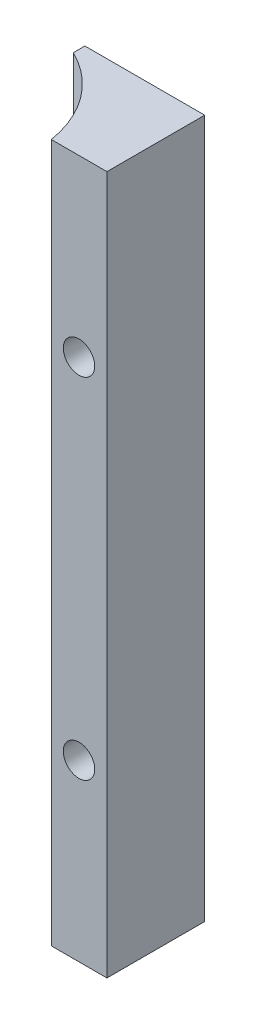
ISO-10303-21;
HEADER;
FILE_DESCRIPTION(('STEP AP214'),'2;1');
FILE_NAME('part.step','',(''),(''),'','','');
FILE_SCHEMA(('AUTOMOTIVE_DESIGN { 1 0 10303 214 1 1 1 1 }'));
ENDSEC;
DATA;
#1=APPLICATION_CONTEXT('core data for automotive mechanical design processes');
#2=APPLICATION_PROTOCOL_DEFINITION('international standard','automotive_design',2000,#1);
#3=PRODUCT_CONTEXT('',#1,'mechanical');
#4=PRODUCT('Part','Part','',(#3));
#5=PRODUCT_RELATED_PRODUCT_CATEGORY('part','',(#4));
#6=PRODUCT_DEFINITION_FORMATION('','',#4);
#7=PRODUCT_DEFINITION_CONTEXT('part definition',#1,'design');
#8=PRODUCT_DEFINITION('design','',#6,#7);
#9=PRODUCT_DEFINITION_SHAPE('','',#8);
#10=(LENGTH_UNIT() NAMED_UNIT(*) SI_UNIT(.MILLI.,.METRE.));
#11=(NAMED_UNIT(*) PLANE_ANGLE_UNIT() SI_UNIT($,.RADIAN.));
#12=(NAMED_UNIT(*) SI_UNIT($,.STERADIAN.) SOLID_ANGLE_UNIT());
#13=UNCERTAINTY_MEASURE_WITH_UNIT(LENGTH_MEASURE(1.E-05),#10,'distance_accuracy_value','');
#14=(GEOMETRIC_REPRESENTATION_CONTEXT(3) GLOBAL_UNCERTAINTY_ASSIGNED_CONTEXT((#13)) GLOBAL_UNIT_ASSIGNED_CONTEXT((#10,
#11,#12)) REPRESENTATION_CONTEXT('',''));
#15=CARTESIAN_POINT('',(0.,0.,0.));
#16=DIRECTION('',(0.,0.,1.));
#17=DIRECTION('',(1.,0.,0.));
#18=AXIS2_PLACEMENT_3D('',#15,#16,#17);
#19=CARTESIAN_POINT('',(-4.78,60.,0.));
#20=DIRECTION('',(0.,0.,-1.));
#21=DIRECTION('',(-1.,0.,0.));
#22=AXIS2_PLACEMENT_3D('',#19,#20,#21);
#23=PLANE('',#22);
#24=CARTESIAN_POINT('',(-2.4,45.,0.));
#25=DIRECTION('',(0.,0.,1.));
#26=DIRECTION('',(1.,0.,0.));
#27=AXIS2_PLACEMENT_3D('',#24,#25,#26);
#28=CIRCLE('',#27,1.35);
#29=CARTESIAN_POINT('',(-1.05,45.,0.));
#30=VERTEX_POINT('',#29);
#31=EDGE_CURVE('E144',#30,#30,#28,.T.);
#32=ORIENTED_EDGE('',*,*,#31,.F.);
#33=EDGE_LOOP('',(#32));
#34=FACE_BOUND('',#33,.T.);
#35=CARTESIAN_POINT('',(-2.39999999999999,15.,0.));
#36=DIRECTION('',(0.,0.,1.));
#37=DIRECTION('',(1.,0.,0.));
#38=AXIS2_PLACEMENT_3D('',#35,#36,#37);
#39=CIRCLE('',#38,1.35);
#40=CARTESIAN_POINT('',(-1.05,15.,0.));
#41=VERTEX_POINT('',#40);
#42=EDGE_CURVE('E147',#41,#41,#39,.T.);
#43=ORIENTED_EDGE('',*,*,#42,.F.);
#44=EDGE_LOOP('',(#43));
#45=FACE_BOUND('',#44,.T.);
#46=DIRECTION('',(1.,0.,0.));
#47=VECTOR('',#46,1.);
#48=CARTESIAN_POINT('',(-4.78,0.,0.));
#49=LINE('',#48,#47);
#50=CARTESIAN_POINT('',(-4.78,0.,0.));
#51=VERTEX_POINT('',#50);
#52=CARTESIAN_POINT('',(0.,0.,0.));
#53=VERTEX_POINT('',#52);
#54=EDGE_CURVE('E108',#51,#53,#49,.T.);
#55=ORIENTED_EDGE('',*,*,#54,.T.);
#56=DIRECTION('',(0.,-1.,0.));
#57=VECTOR('',#56,1.);
#58=CARTESIAN_POINT('',(0.,60.,0.));
#59=LINE('',#58,#57);
#60=CARTESIAN_POINT('',(0.,60.,0.));
#61=VERTEX_POINT('',#60);
#62=EDGE_CURVE('E11',#61,#53,#59,.T.);
#63=ORIENTED_EDGE('',*,*,#62,.F.);
#64=DIRECTION('',(1.,0.,0.));
#65=VECTOR('',#64,1.);
#66=CARTESIAN_POINT('',(-4.78,60.,0.));
#67=LINE('',#66,#65);
#68=CARTESIAN_POINT('',(-4.78,60.,0.));
#69=VERTEX_POINT('',#68);
#70=EDGE_CURVE('E117',#69,#61,#67,.T.);
#71=ORIENTED_EDGE('',*,*,#70,.F.);
#72=DIRECTION('',(0.,-1.,0.));
#73=VECTOR('',#72,1.);
#74=CARTESIAN_POINT('',(-4.78,60.,0.));
#75=LINE('',#74,#73);
#76=EDGE_CURVE('E104',#69,#51,#75,.T.);
#77=ORIENTED_EDGE('',*,*,#76,.T.);
#78=EDGE_LOOP('',(#55,#63,#71,#77));
#79=FACE_BOUND('',#78,.T.);
#80=ADVANCED_FACE('F34',(#34,#45,#79),#23,.F.);
#81=CARTESIAN_POINT('',(0.,60.,0.));
#82=DIRECTION('',(-1.,0.,0.));
#83=DIRECTION('',(0.,0.,1.));
#84=AXIS2_PLACEMENT_3D('',#81,#82,#83);
#85=PLANE('',#84);
#86=DIRECTION('',(0.,0.,-1.));
#87=VECTOR('',#86,1.);
#88=CARTESIAN_POINT('',(0.,0.,0.));
#89=LINE('',#88,#87);
#90=CARTESIAN_POINT('',(0.,0.,-8.4));
#91=VERTEX_POINT('',#90);
#92=EDGE_CURVE('E111',#53,#91,#89,.T.);
#93=ORIENTED_EDGE('',*,*,#92,.T.);
#94=DIRECTION('',(0.,-1.,0.));
#95=VECTOR('',#94,1.);
#96=CARTESIAN_POINT('',(0.,60.,-8.4));
#97=LINE('',#96,#95);
#98=CARTESIAN_POINT('',(0.,60.,-8.4));
#99=VERTEX_POINT('',#98);
#100=EDGE_CURVE('E42',#99,#91,#97,.T.);
#101=ORIENTED_EDGE('',*,*,#100,.F.);
#102=DIRECTION('',(0.,0.,-1.));
#103=VECTOR('',#102,1.);
#104=CARTESIAN_POINT('',(0.,60.,0.));
#105=LINE('',#104,#103);
#106=EDGE_CURVE('E84',#61,#99,#105,.T.);
#107=ORIENTED_EDGE('',*,*,#106,.F.);
#108=ORIENTED_EDGE('',*,*,#62,.T.);
#109=EDGE_LOOP('',(#93,#101,#107,#108));
#110=FACE_BOUND('',#109,.T.);
#111=ADVANCED_FACE('F136',(#110),#85,.F.);
#112=CARTESIAN_POINT('',(0.,60.,-8.4));
#113=DIRECTION('',(0.,0.,1.));
#114=DIRECTION('',(1.,0.,0.));
#115=AXIS2_PLACEMENT_3D('',#112,#113,#114);
#116=PLANE('',#115);
#117=CARTESIAN_POINT('',(-2.4,45.,-8.4));
#118=DIRECTION('',(0.,0.,1.));
#119=DIRECTION('',(1.,0.,0.));
#120=AXIS2_PLACEMENT_3D('',#117,#118,#119);
#121=CIRCLE('',#120,1.35);
#122=CARTESIAN_POINT('',(-1.05,45.,-8.4));
#123=VERTEX_POINT('',#122);
#124=EDGE_CURVE('E149',#123,#123,#121,.T.);
#125=ORIENTED_EDGE('',*,*,#124,.T.);
#126=EDGE_LOOP('',(#125));
#127=FACE_BOUND('',#126,.T.);
#128=CARTESIAN_POINT('',(-2.39999999999999,15.,-8.4));
#129=DIRECTION('',(0.,0.,1.));
#130=DIRECTION('',(1.,0.,0.));
#131=AXIS2_PLACEMENT_3D('',#128,#129,#130);
#132=CIRCLE('',#131,1.35);
#133=CARTESIAN_POINT('',(-1.05,15.,-8.4));
#134=VERTEX_POINT('',#133);
#135=EDGE_CURVE('E112',#134,#134,#132,.T.);
#136=ORIENTED_EDGE('',*,*,#135,.T.);
#137=EDGE_LOOP('',(#136));
#138=FACE_BOUND('',#137,.T.);
#139=DIRECTION('',(-1.,0.,0.));
#140=VECTOR('',#139,1.);
#141=CARTESIAN_POINT('',(0.,0.,-8.4));
#142=LINE('',#141,#140);
#143=CARTESIAN_POINT('',(-10.2922711998618,0.,-8.4));
#144=VERTEX_POINT('',#143);
#145=EDGE_CURVE('E99',#91,#144,#142,.T.);
#146=ORIENTED_EDGE('',*,*,#145,.T.);
#147=DIRECTION('',(0.,-1.,0.));
#148=VECTOR('',#147,1.);
#149=CARTESIAN_POINT('',(-10.2922711998618,60.,-8.4));
#150=LINE('',#149,#148);
#151=CARTESIAN_POINT('',(-10.2922711998618,60.,-8.4));
#152=VERTEX_POINT('',#151);
#153=EDGE_CURVE('E96',#152,#144,#150,.T.);
#154=ORIENTED_EDGE('',*,*,#153,.F.);
#155=DIRECTION('',(-1.,0.,0.));
#156=VECTOR('',#155,1.);
#157=CARTESIAN_POINT('',(0.,60.,-8.4));
#158=LINE('',#157,#156);
#159=EDGE_CURVE('E88',#99,#152,#158,.T.);
#160=ORIENTED_EDGE('',*,*,#159,.F.);
#161=ORIENTED_EDGE('',*,*,#100,.T.);
#162=EDGE_LOOP('',(#146,#154,#160,#161));
#163=FACE_BOUND('',#162,.T.);
#164=ADVANCED_FACE('F97',(#127,#138,#163),#116,.F.);
#165=CARTESIAN_POINT('',(-10.2922711998618,60.,-8.4));
#166=DIRECTION('',(1.,0.,0.));
#167=DIRECTION('',(0.,0.,-1.));
#168=AXIS2_PLACEMENT_3D('',#165,#166,#167);
#169=PLANE('',#168);
#170=DIRECTION('',(0.,0.,1.));
#171=VECTOR('',#170,1.);
#172=CARTESIAN_POINT('',(-10.2922711998618,0.,-8.4));
#173=LINE('',#172,#171);
#174=CARTESIAN_POINT('',(-10.2922711998618,0.,-7.4));
#175=VERTEX_POINT('',#174);
#176=EDGE_CURVE('E70',#144,#175,#173,.T.);
#177=ORIENTED_EDGE('',*,*,#176,.T.);
#178=DIRECTION('',(0.,-1.,0.));
#179=VECTOR('',#178,1.);
#180=CARTESIAN_POINT('',(-10.2922711998618,60.,-7.4));
#181=LINE('',#180,#179);
#182=CARTESIAN_POINT('',(-10.2922711998618,60.,-7.4));
#183=VERTEX_POINT('',#182);
#184=EDGE_CURVE('E100',#183,#175,#181,.T.);
#185=ORIENTED_EDGE('',*,*,#184,.F.);
#186=DIRECTION('',(0.,0.,1.));
#187=VECTOR('',#186,1.);
#188=CARTESIAN_POINT('',(-10.2922711998618,60.,-8.4));
#189=LINE('',#188,#187);
#190=EDGE_CURVE('E92',#152,#183,#189,.T.);
#191=ORIENTED_EDGE('',*,*,#190,.F.);
#192=ORIENTED_EDGE('',*,*,#153,.T.);
#193=EDGE_LOOP('',(#177,#185,#191,#192));
#194=FACE_BOUND('',#193,.T.);
#195=ADVANCED_FACE('F102',(#194),#169,.F.);
#196=CARTESIAN_POINT('',(-14.6511701434025,60.,1.6));
#197=DIRECTION('',(0.,-1.,0.));
#198=DIRECTION('',(0.,0.,-1.));
#199=AXIS2_PLACEMENT_3D('',#196,#197,#198);
#200=CYLINDRICAL_SURFACE('',#199,10.);
#201=CARTESIAN_POINT('',(-14.6511701434025,0.,1.6));
#202=DIRECTION('',(0.,-1.,0.));
#203=DIRECTION('',(0.,0.,-1.));
#204=AXIS2_PLACEMENT_3D('',#201,#202,#203);
#205=CIRCLE('',#204,10.);
#206=EDGE_CURVE('E76',#175,#51,#205,.T.);
#207=ORIENTED_EDGE('',*,*,#206,.T.);
#208=ORIENTED_EDGE('',*,*,#76,.F.);
#209=CARTESIAN_POINT('',(-14.6511701434025,60.,1.6));
#210=DIRECTION('',(0.,-1.,0.));
#211=DIRECTION('',(0.,0.,-1.));
#212=AXIS2_PLACEMENT_3D('',#209,#210,#211);
#213=CIRCLE('',#212,10.);
#214=EDGE_CURVE('E50',#183,#69,#213,.T.);
#215=ORIENTED_EDGE('',*,*,#214,.F.);
#216=ORIENTED_EDGE('',*,*,#184,.T.);
#217=EDGE_LOOP('',(#207,#208,#215,#216));
#218=FACE_BOUND('',#217,.T.);
#219=ADVANCED_FACE('F125',(#218),#200,.F.);
#220=CARTESIAN_POINT('',(-14.6511701434025,60.,1.6));
#221=DIRECTION('',(0.,-1.,0.));
#222=DIRECTION('',(0.,0.,-1.));
#223=AXIS2_PLACEMENT_3D('',#220,#221,#222);
#224=PLANE('',#223);
#225=ORIENTED_EDGE('',*,*,#70,.T.);
#226=ORIENTED_EDGE('',*,*,#106,.T.);
#227=ORIENTED_EDGE('',*,*,#159,.T.);
#228=ORIENTED_EDGE('',*,*,#190,.T.);
#229=ORIENTED_EDGE('',*,*,#214,.T.);
#230=EDGE_LOOP('',(#225,#226,#227,#228,#229));
#231=FACE_BOUND('',#230,.T.);
#232=ADVANCED_FACE('F90',(#231),#224,.F.);
#233=CARTESIAN_POINT('',(-14.6511701434025,0.,1.6));
#234=DIRECTION('',(0.,-1.,0.));
#235=DIRECTION('',(0.,0.,-1.));
#236=AXIS2_PLACEMENT_3D('',#233,#234,#235);
#237=PLANE('',#236);
#238=ORIENTED_EDGE('',*,*,#54,.F.);
#239=ORIENTED_EDGE('',*,*,#206,.F.);
#240=ORIENTED_EDGE('',*,*,#176,.F.);
#241=ORIENTED_EDGE('',*,*,#145,.F.);
#242=ORIENTED_EDGE('',*,*,#92,.F.);
#243=EDGE_LOOP('',(#238,#239,#240,#241,#242));
#244=FACE_BOUND('',#243,.T.);
#245=ADVANCED_FACE('F121',(#244),#237,.T.);
#246=CARTESIAN_POINT('',(-2.39999999999999,15.,0.));
#247=DIRECTION('',(0.,0.,1.));
#248=DIRECTION('',(1.,0.,0.));
#249=AXIS2_PLACEMENT_3D('',#246,#247,#248);
#250=CYLINDRICAL_SURFACE('',#249,1.35);
#251=ORIENTED_EDGE('',*,*,#135,.F.);
#252=EDGE_LOOP('',(#251));
#253=FACE_BOUND('',#252,.T.);
#254=ORIENTED_EDGE('',*,*,#42,.T.);
#255=EDGE_LOOP('',(#254));
#256=FACE_BOUND('',#255,.T.);
#257=ADVANCED_FACE('F160',(#253,#256),#250,.F.);
#258=CARTESIAN_POINT('',(-2.4,45.,0.));
#259=DIRECTION('',(0.,0.,1.));
#260=DIRECTION('',(1.,0.,0.));
#261=AXIS2_PLACEMENT_3D('',#258,#259,#260);
#262=CYLINDRICAL_SURFACE('',#261,1.35);
#263=ORIENTED_EDGE('',*,*,#124,.F.);
#264=EDGE_LOOP('',(#263));
#265=FACE_BOUND('',#264,.T.);
#266=ORIENTED_EDGE('',*,*,#31,.T.);
#267=EDGE_LOOP('',(#266));
#268=FACE_BOUND('',#267,.T.);
#269=ADVANCED_FACE('F158',(#265,#268),#262,.F.);
#270=CLOSED_SHELL('',(#80,#111,#164,#195,#219,#232,#245,#257,#269));
#271=MANIFOLD_SOLID_BREP('B2',#270);
#272=ADVANCED_BREP_SHAPE_REPRESENTATION('',(#18,#271),#14);
#273=SHAPE_DEFINITION_REPRESENTATION(#9,#272);
ENDSEC;
END-ISO-10303-21;
